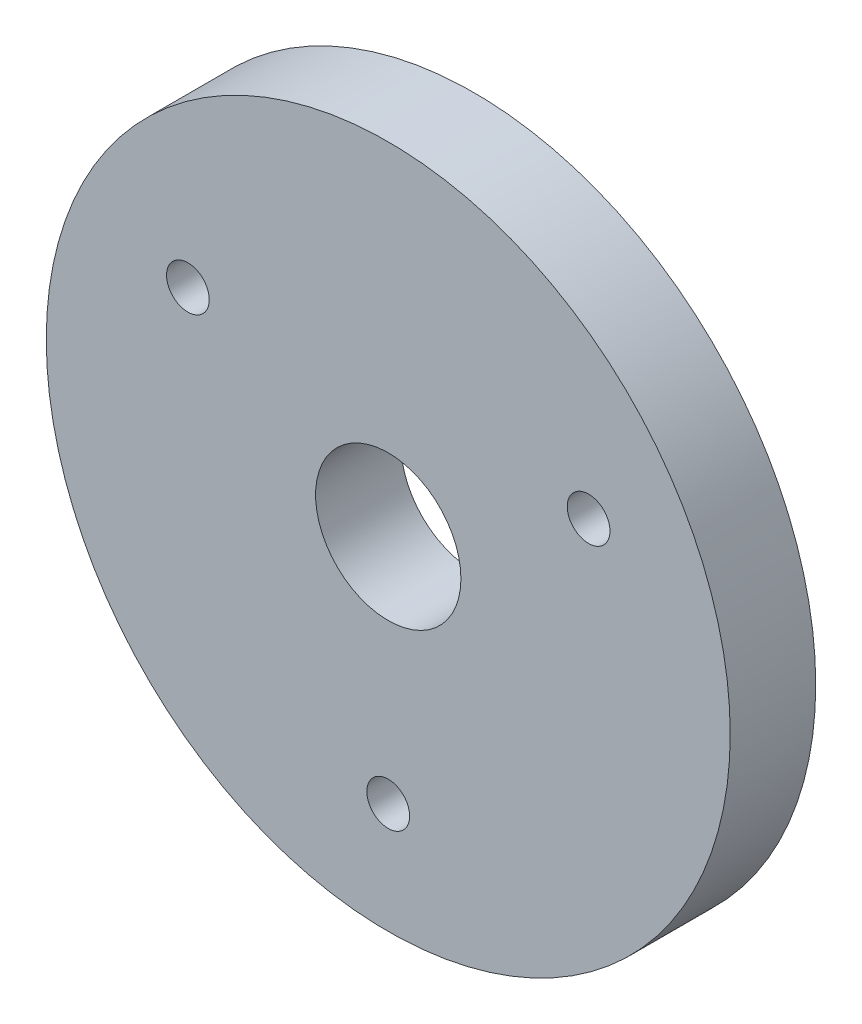
ISO-10303-21;
HEADER;
FILE_DESCRIPTION(('STEP AP214'),'2;1');
FILE_NAME('part.step','',(''),(''),'','','');
FILE_SCHEMA(('AUTOMOTIVE_DESIGN { 1 0 10303 214 1 1 1 1 }'));
ENDSEC;
DATA;
#1=APPLICATION_CONTEXT('core data for automotive mechanical design processes');
#2=APPLICATION_PROTOCOL_DEFINITION('international standard','automotive_design',2000,#1);
#3=PRODUCT_CONTEXT('',#1,'mechanical');
#4=PRODUCT('Part','Part','',(#3));
#5=PRODUCT_RELATED_PRODUCT_CATEGORY('part','',(#4));
#6=PRODUCT_DEFINITION_FORMATION('','',#4);
#7=PRODUCT_DEFINITION_CONTEXT('part definition',#1,'design');
#8=PRODUCT_DEFINITION('design','',#6,#7);
#9=PRODUCT_DEFINITION_SHAPE('','',#8);
#10=(LENGTH_UNIT() NAMED_UNIT(*) SI_UNIT(.MILLI.,.METRE.));
#11=(NAMED_UNIT(*) PLANE_ANGLE_UNIT() SI_UNIT($,.RADIAN.));
#12=(NAMED_UNIT(*) SI_UNIT($,.STERADIAN.) SOLID_ANGLE_UNIT());
#13=UNCERTAINTY_MEASURE_WITH_UNIT(LENGTH_MEASURE(1.E-05),#10,'distance_accuracy_value','');
#14=(GEOMETRIC_REPRESENTATION_CONTEXT(3) GLOBAL_UNCERTAINTY_ASSIGNED_CONTEXT((#13)) GLOBAL_UNIT_ASSIGNED_CONTEXT((#10,
#11,#12)) REPRESENTATION_CONTEXT('',''));
#15=CARTESIAN_POINT('',(0.,0.,0.));
#16=DIRECTION('',(0.,0.,1.));
#17=DIRECTION('',(1.,0.,0.));
#18=AXIS2_PLACEMENT_3D('',#15,#16,#17);
#19=CARTESIAN_POINT('',(0.,0.,5.));
#20=DIRECTION('',(0.,0.,1.));
#21=DIRECTION('',(1.,0.,0.));
#22=AXIS2_PLACEMENT_3D('',#19,#20,#21);
#23=PLANE('',#22);
#24=CARTESIAN_POINT('',(-11.7173237132034,6.76500000000006,5.));
#25=DIRECTION('',(0.,0.,1.));
#26=DIRECTION('',(1.,0.,0.));
#27=AXIS2_PLACEMENT_3D('',#24,#25,#26);
#28=CIRCLE('',#27,1.25);
#29=CARTESIAN_POINT('',(-10.4673237132034,6.76500000000006,5.));
#30=VERTEX_POINT('',#29);
#31=EDGE_CURVE('E53',#30,#30,#28,.T.);
#32=ORIENTED_EDGE('',*,*,#31,.F.);
#33=EDGE_LOOP('',(#32));
#34=FACE_BOUND('',#33,.T.);
#35=CARTESIAN_POINT('',(0.,0.,5.));
#36=DIRECTION('',(0.,0.,1.));
#37=DIRECTION('',(1.,0.,0.));
#38=AXIS2_PLACEMENT_3D('',#35,#36,#37);
#39=CIRCLE('',#38,4.25);
#40=CARTESIAN_POINT('',(4.25,0.,5.));
#41=VERTEX_POINT('',#40);
#42=EDGE_CURVE('E42',#41,#41,#39,.T.);
#43=ORIENTED_EDGE('',*,*,#42,.F.);
#44=EDGE_LOOP('',(#43));
#45=FACE_BOUND('',#44,.T.);
#46=CARTESIAN_POINT('',(0.,0.,5.));
#47=DIRECTION('',(0.,0.,1.));
#48=DIRECTION('',(1.,0.,0.));
#49=AXIS2_PLACEMENT_3D('',#46,#47,#48);
#50=CIRCLE('',#49,20.);
#51=CARTESIAN_POINT('',(20.,0.,5.));
#52=VERTEX_POINT('',#51);
#53=EDGE_CURVE('E10',#52,#52,#50,.T.);
#54=ORIENTED_EDGE('',*,*,#53,.T.);
#55=EDGE_LOOP('',(#54));
#56=FACE_BOUND('',#55,.T.);
#57=CARTESIAN_POINT('',(0.,-13.53,5.));
#58=DIRECTION('',(0.,0.,1.));
#59=DIRECTION('',(1.,0.,0.));
#60=AXIS2_PLACEMENT_3D('',#57,#58,#59);
#61=CIRCLE('',#60,1.25);
#62=CARTESIAN_POINT('',(1.25,-13.53,5.));
#63=VERTEX_POINT('',#62);
#64=EDGE_CURVE('E47',#63,#63,#61,.T.);
#65=ORIENTED_EDGE('',*,*,#64,.F.);
#66=EDGE_LOOP('',(#65));
#67=FACE_BOUND('',#66,.T.);
#68=CARTESIAN_POINT('',(11.7173237132035,6.76499999999989,5.));
#69=DIRECTION('',(0.,0.,1.));
#70=DIRECTION('',(1.,0.,0.));
#71=AXIS2_PLACEMENT_3D('',#68,#69,#70);
#72=CIRCLE('',#71,1.25);
#73=CARTESIAN_POINT('',(12.9673237132035,6.76499999999989,5.));
#74=VERTEX_POINT('',#73);
#75=EDGE_CURVE('E59',#74,#74,#72,.T.);
#76=ORIENTED_EDGE('',*,*,#75,.F.);
#77=EDGE_LOOP('',(#76));
#78=FACE_BOUND('',#77,.T.);
#79=ADVANCED_FACE('F31',(#34,#45,#56,#67,#78),#23,.T.);
#80=CARTESIAN_POINT('',(0.,0.,0.));
#81=DIRECTION('',(0.,0.,1.));
#82=DIRECTION('',(1.,0.,0.));
#83=AXIS2_PLACEMENT_3D('',#80,#81,#82);
#84=PLANE('',#83);
#85=CARTESIAN_POINT('',(0.,0.,0.));
#86=DIRECTION('',(0.,0.,1.));
#87=DIRECTION('',(1.,0.,0.));
#88=AXIS2_PLACEMENT_3D('',#85,#86,#87);
#89=CIRCLE('',#88,20.);
#90=CARTESIAN_POINT('',(20.,0.,0.));
#91=VERTEX_POINT('',#90);
#92=EDGE_CURVE('E35',#91,#91,#89,.T.);
#93=ORIENTED_EDGE('',*,*,#92,.F.);
#94=EDGE_LOOP('',(#93));
#95=FACE_BOUND('',#94,.T.);
#96=CARTESIAN_POINT('',(0.,0.,0.));
#97=DIRECTION('',(0.,0.,1.));
#98=DIRECTION('',(1.,0.,0.));
#99=AXIS2_PLACEMENT_3D('',#96,#97,#98);
#100=CIRCLE('',#99,4.25);
#101=CARTESIAN_POINT('',(4.25,0.,0.));
#102=VERTEX_POINT('',#101);
#103=EDGE_CURVE('E44',#102,#102,#100,.T.);
#104=ORIENTED_EDGE('',*,*,#103,.T.);
#105=EDGE_LOOP('',(#104));
#106=FACE_BOUND('',#105,.T.);
#107=CARTESIAN_POINT('',(0.,-13.53,0.));
#108=DIRECTION('',(0.,0.,1.));
#109=DIRECTION('',(1.,0.,0.));
#110=AXIS2_PLACEMENT_3D('',#107,#108,#109);
#111=CIRCLE('',#110,1.25);
#112=CARTESIAN_POINT('',(1.25,-13.53,0.));
#113=VERTEX_POINT('',#112);
#114=EDGE_CURVE('E50',#113,#113,#111,.T.);
#115=ORIENTED_EDGE('',*,*,#114,.T.);
#116=EDGE_LOOP('',(#115));
#117=FACE_BOUND('',#116,.T.);
#118=CARTESIAN_POINT('',(-11.7173237132034,6.76500000000006,0.));
#119=DIRECTION('',(0.,0.,1.));
#120=DIRECTION('',(1.,0.,0.));
#121=AXIS2_PLACEMENT_3D('',#118,#119,#120);
#122=CIRCLE('',#121,1.25);
#123=CARTESIAN_POINT('',(-10.4673237132034,6.76500000000006,0.));
#124=VERTEX_POINT('',#123);
#125=EDGE_CURVE('E56',#124,#124,#122,.T.);
#126=ORIENTED_EDGE('',*,*,#125,.T.);
#127=EDGE_LOOP('',(#126));
#128=FACE_BOUND('',#127,.T.);
#129=CARTESIAN_POINT('',(11.7173237132035,6.76499999999989,0.));
#130=DIRECTION('',(0.,0.,1.));
#131=DIRECTION('',(1.,0.,0.));
#132=AXIS2_PLACEMENT_3D('',#129,#130,#131);
#133=CIRCLE('',#132,1.25);
#134=CARTESIAN_POINT('',(12.9673237132035,6.76499999999989,0.));
#135=VERTEX_POINT('',#134);
#136=EDGE_CURVE('E62',#135,#135,#133,.T.);
#137=ORIENTED_EDGE('',*,*,#136,.T.);
#138=EDGE_LOOP('',(#137));
#139=FACE_BOUND('',#138,.T.);
#140=ADVANCED_FACE('F72',(#95,#106,#117,#128,#139),#84,.F.);
#141=CARTESIAN_POINT('',(0.,0.,5.));
#142=DIRECTION('',(0.,0.,-1.));
#143=DIRECTION('',(-1.,0.,0.));
#144=AXIS2_PLACEMENT_3D('',#141,#142,#143);
#145=CYLINDRICAL_SURFACE('',#144,20.);
#146=ORIENTED_EDGE('',*,*,#53,.F.);
#147=EDGE_LOOP('',(#146));
#148=FACE_BOUND('',#147,.T.);
#149=ORIENTED_EDGE('',*,*,#92,.T.);
#150=EDGE_LOOP('',(#149));
#151=FACE_BOUND('',#150,.T.);
#152=ADVANCED_FACE('F33',(#148,#151),#145,.T.);
#153=CARTESIAN_POINT('',(0.,0.,5.));
#154=DIRECTION('',(0.,0.,-1.));
#155=DIRECTION('',(-1.,0.,0.));
#156=AXIS2_PLACEMENT_3D('',#153,#154,#155);
#157=CYLINDRICAL_SURFACE('',#156,4.25);
#158=ORIENTED_EDGE('',*,*,#42,.T.);
#159=EDGE_LOOP('',(#158));
#160=FACE_BOUND('',#159,.T.);
#161=ORIENTED_EDGE('',*,*,#103,.F.);
#162=EDGE_LOOP('',(#161));
#163=FACE_BOUND('',#162,.T.);
#164=ADVANCED_FACE('F82',(#160,#163),#157,.F.);
#165=CARTESIAN_POINT('',(0.,-13.53,5.));
#166=DIRECTION('',(0.,0.,-1.));
#167=DIRECTION('',(-1.,0.,0.));
#168=AXIS2_PLACEMENT_3D('',#165,#166,#167);
#169=CYLINDRICAL_SURFACE('',#168,1.25);
#170=ORIENTED_EDGE('',*,*,#64,.T.);
#171=EDGE_LOOP('',(#170));
#172=FACE_BOUND('',#171,.T.);
#173=ORIENTED_EDGE('',*,*,#114,.F.);
#174=EDGE_LOOP('',(#173));
#175=FACE_BOUND('',#174,.T.);
#176=ADVANCED_FACE('F85',(#172,#175),#169,.F.);
#177=CARTESIAN_POINT('',(-11.7173237132034,6.76500000000006,5.));
#178=DIRECTION('',(0.,0.,-1.));
#179=DIRECTION('',(-1.,0.,0.));
#180=AXIS2_PLACEMENT_3D('',#177,#178,#179);
#181=CYLINDRICAL_SURFACE('',#180,1.25);
#182=ORIENTED_EDGE('',*,*,#31,.T.);
#183=EDGE_LOOP('',(#182));
#184=FACE_BOUND('',#183,.T.);
#185=ORIENTED_EDGE('',*,*,#125,.F.);
#186=EDGE_LOOP('',(#185));
#187=FACE_BOUND('',#186,.T.);
#188=ADVANCED_FACE('F89',(#184,#187),#181,.F.);
#189=CARTESIAN_POINT('',(11.7173237132035,6.76499999999989,5.));
#190=DIRECTION('',(0.,0.,-1.));
#191=DIRECTION('',(-1.,0.,0.));
#192=AXIS2_PLACEMENT_3D('',#189,#190,#191);
#193=CYLINDRICAL_SURFACE('',#192,1.25);
#194=ORIENTED_EDGE('',*,*,#75,.T.);
#195=EDGE_LOOP('',(#194));
#196=FACE_BOUND('',#195,.T.);
#197=ORIENTED_EDGE('',*,*,#136,.F.);
#198=EDGE_LOOP('',(#197));
#199=FACE_BOUND('',#198,.T.);
#200=ADVANCED_FACE('F68',(#196,#199),#193,.F.);
#201=CLOSED_SHELL('',(#79,#140,#152,#164,#176,#188,#200));
#202=MANIFOLD_SOLID_BREP('B2',#201);
#203=ADVANCED_BREP_SHAPE_REPRESENTATION('',(#18,#202),#14);
#204=SHAPE_DEFINITION_REPRESENTATION(#9,#203);
ENDSEC;
END-ISO-10303-21;
